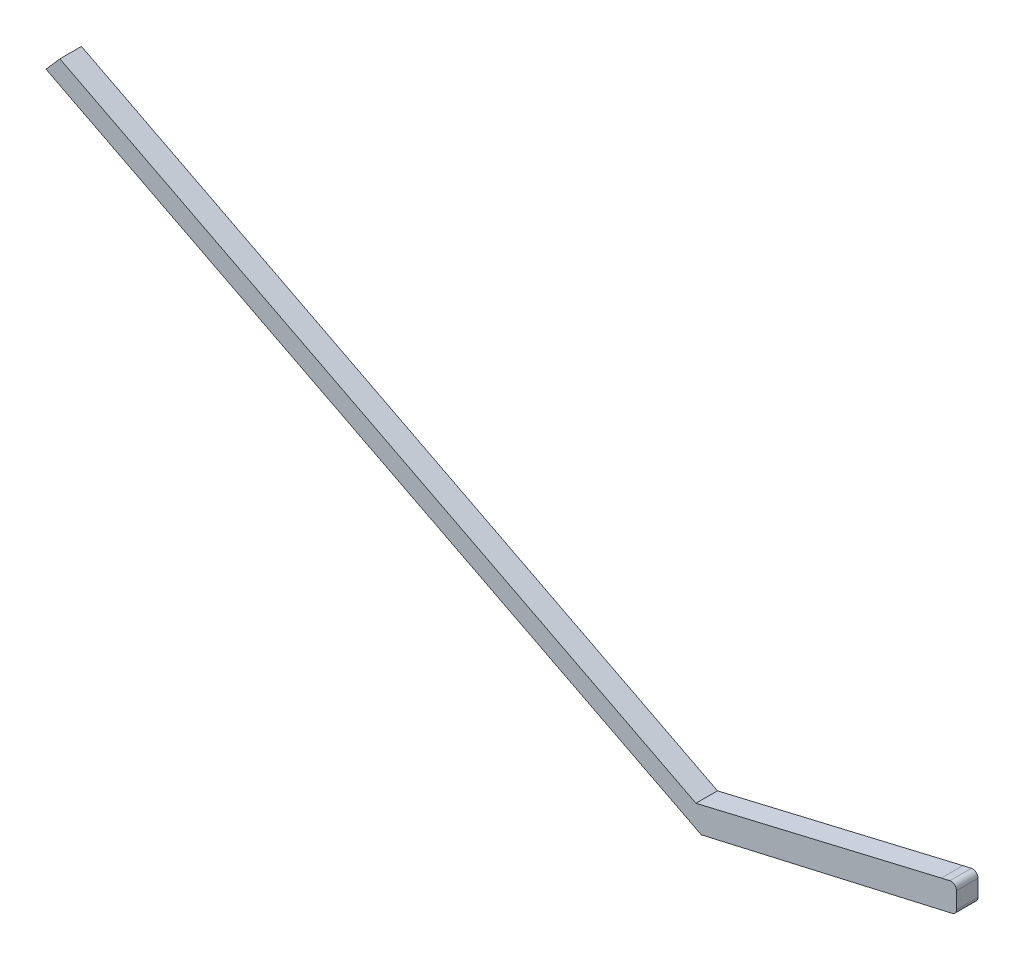
ISO-10303-21;
HEADER;
FILE_DESCRIPTION(('STEP AP214'),'2;1');
FILE_NAME('part.step','',(''),(''),'','','');
FILE_SCHEMA(('AUTOMOTIVE_DESIGN { 1 0 10303 214 1 1 1 1 }'));
ENDSEC;
DATA;
#1=APPLICATION_CONTEXT('core data for automotive mechanical design processes');
#2=APPLICATION_PROTOCOL_DEFINITION('international standard','automotive_design',2000,#1);
#3=PRODUCT_CONTEXT('',#1,'mechanical');
#4=PRODUCT('Part','Part','',(#3));
#5=PRODUCT_RELATED_PRODUCT_CATEGORY('part','',(#4));
#6=PRODUCT_DEFINITION_FORMATION('','',#4);
#7=PRODUCT_DEFINITION_CONTEXT('part definition',#1,'design');
#8=PRODUCT_DEFINITION('design','',#6,#7);
#9=PRODUCT_DEFINITION_SHAPE('','',#8);
#10=(LENGTH_UNIT() NAMED_UNIT(*) SI_UNIT(.MILLI.,.METRE.));
#11=(NAMED_UNIT(*) PLANE_ANGLE_UNIT() SI_UNIT($,.RADIAN.));
#12=(NAMED_UNIT(*) SI_UNIT($,.STERADIAN.) SOLID_ANGLE_UNIT());
#13=UNCERTAINTY_MEASURE_WITH_UNIT(LENGTH_MEASURE(1.E-05),#10,'distance_accuracy_value','');
#14=(GEOMETRIC_REPRESENTATION_CONTEXT(3) GLOBAL_UNCERTAINTY_ASSIGNED_CONTEXT((#13)) GLOBAL_UNIT_ASSIGNED_CONTEXT((#10,
#11,#12)) REPRESENTATION_CONTEXT('',''));
#15=CARTESIAN_POINT('',(0.,0.,0.));
#16=DIRECTION('',(0.,0.,1.));
#17=DIRECTION('',(1.,0.,0.));
#18=AXIS2_PLACEMENT_3D('',#15,#16,#17);
#19=CARTESIAN_POINT('',(-42.5003193569987,-16.6773008257501,2.));
#20=DIRECTION('',(0.455637859415307,0.890165232452626,0.));
#21=DIRECTION('',(-0.890165232452626,0.455637859415307,0.));
#22=AXIS2_PLACEMENT_3D('',#19,#20,#21);
#23=PLANE('',#22);
#24=DIRECTION('',(0.890165232452626,-0.455637859415307,0.));
#25=VECTOR('',#24,1.);
#26=CARTESIAN_POINT('',(-42.5003193569987,-16.6773008257501,0.));
#27=LINE('',#26,#25);
#28=CARTESIAN_POINT('',(-103.313556119557,14.4504179532271,0.));
#29=VERTEX_POINT('',#28);
#30=CARTESIAN_POINT('',(-42.5003193569987,-16.6773008257501,0.));
#31=VERTEX_POINT('',#30);
#32=EDGE_CURVE('E141',#29,#31,#27,.T.);
#33=ORIENTED_EDGE('',*,*,#32,.T.);
#34=DIRECTION('',(0.,0.,-1.));
#35=VECTOR('',#34,1.);
#36=CARTESIAN_POINT('',(-42.5003193569987,-16.6773008257501,2.));
#37=LINE('',#36,#35);
#38=CARTESIAN_POINT('',(-42.5003193569987,-16.6773008257501,2.));
#39=VERTEX_POINT('',#38);
#40=EDGE_CURVE('E11',#39,#31,#37,.T.);
#41=ORIENTED_EDGE('',*,*,#40,.F.);
#42=DIRECTION('',(0.890165232452626,-0.455637859415307,0.));
#43=VECTOR('',#42,1.);
#44=CARTESIAN_POINT('',(-42.5003193569987,-16.6773008257501,2.));
#45=LINE('',#44,#43);
#46=CARTESIAN_POINT('',(-103.313556119557,14.4504179532271,2.));
#47=VERTEX_POINT('',#46);
#48=EDGE_CURVE('E159',#47,#39,#45,.T.);
#49=ORIENTED_EDGE('',*,*,#48,.F.);
#50=DIRECTION('',(0.,0.,-1.));
#51=VECTOR('',#50,1.);
#52=CARTESIAN_POINT('',(-103.313556119557,14.4504179532271,2.));
#53=LINE('',#52,#51);
#54=EDGE_CURVE('E137',#47,#29,#53,.T.);
#55=ORIENTED_EDGE('',*,*,#54,.T.);
#56=EDGE_LOOP('',(#33,#41,#49,#55));
#57=FACE_BOUND('',#56,.T.);
#58=ADVANCED_FACE('F33',(#57),#23,.F.);
#59=CARTESIAN_POINT('',(-20.,-11.5262200151905,2.));
#60=DIRECTION('',(-0.223160367692443,0.97478174495185,0.));
#61=DIRECTION('',(-0.97478174495185,-0.223160367692443,0.));
#62=AXIS2_PLACEMENT_3D('',#59,#60,#61);
#63=PLANE('',#62);
#64=DIRECTION('',(0.97478174495185,0.223160367692443,0.));
#65=VECTOR('',#64,1.);
#66=CARTESIAN_POINT('',(-20.,-11.5262200151905,0.));
#67=LINE('',#66,#65);
#68=CARTESIAN_POINT('',(-20.,-11.5262200151905,0.));
#69=VERTEX_POINT('',#68);
#70=EDGE_CURVE('E144',#31,#69,#67,.T.);
#71=ORIENTED_EDGE('',*,*,#70,.T.);
#72=DIRECTION('',(0.,0.,-1.));
#73=VECTOR('',#72,1.);
#74=CARTESIAN_POINT('',(-20.,-11.5262200151905,2.));
#75=LINE('',#74,#73);
#76=CARTESIAN_POINT('',(-20.,-11.5262200151905,2.));
#77=VERTEX_POINT('',#76);
#78=EDGE_CURVE('E41',#77,#69,#75,.T.);
#79=ORIENTED_EDGE('',*,*,#78,.F.);
#80=DIRECTION('',(0.97478174495185,0.223160367692443,0.));
#81=VECTOR('',#80,1.);
#82=CARTESIAN_POINT('',(-20.,-11.5262200151905,2.));
#83=LINE('',#82,#81);
#84=EDGE_CURVE('E98',#39,#77,#83,.T.);
#85=ORIENTED_EDGE('',*,*,#84,.F.);
#86=ORIENTED_EDGE('',*,*,#40,.T.);
#87=EDGE_LOOP('',(#71,#79,#85,#86));
#88=FACE_BOUND('',#87,.T.);
#89=ADVANCED_FACE('F208',(#88),#63,.F.);
#90=CARTESIAN_POINT('',(-20.,-11.5262200151905,2.));
#91=DIRECTION('',(-0.2204816590475,0.975391120537634,0.));
#92=DIRECTION('',(-0.975391120537634,-0.2204816590475,0.));
#93=AXIS2_PLACEMENT_3D('',#90,#91,#92);
#94=PLANE('',#93);
#95=DIRECTION('',(0.975391120537634,0.2204816590475,0.));
#96=VECTOR('',#95,1.);
#97=CARTESIAN_POINT('',(-20.,-11.5262200151905,0.));
#98=LINE('',#97,#96);
#99=CARTESIAN_POINT('',(-19.2098276984466,-11.3476060250571,0.));
#100=VERTEX_POINT('',#99);
#101=EDGE_CURVE('E146',#69,#100,#98,.T.);
#102=ORIENTED_EDGE('',*,*,#101,.T.);
#103=DIRECTION('',(0.,0.,-1.));
#104=VECTOR('',#103,1.);
#105=CARTESIAN_POINT('',(-19.2098276984466,-11.3476060250571,2.));
#106=LINE('',#105,#104);
#107=CARTESIAN_POINT('',(-19.2098276984466,-11.3476060250571,2.));
#108=VERTEX_POINT('',#107);
#109=EDGE_CURVE('E172',#108,#100,#106,.T.);
#110=ORIENTED_EDGE('',*,*,#109,.F.);
#111=DIRECTION('',(0.975391120537634,0.2204816590475,0.));
#112=VECTOR('',#111,1.);
#113=CARTESIAN_POINT('',(-20.,-11.5262200151905,2.));
#114=LINE('',#113,#112);
#115=EDGE_CURVE('E180',#77,#108,#114,.T.);
#116=ORIENTED_EDGE('',*,*,#115,.F.);
#117=ORIENTED_EDGE('',*,*,#78,.T.);
#118=EDGE_LOOP('',(#102,#110,#116,#117));
#119=FACE_BOUND('',#118,.T.);
#120=ADVANCED_FACE('F178',(#119),#94,.F.);
#121=CARTESIAN_POINT('',(-19.3214018643038,-10.8602137749,2.));
#122=DIRECTION('',(0.,0.,-1.));
#123=DIRECTION('',(-1.,0.,0.));
#124=AXIS2_PLACEMENT_3D('',#121,#122,#123);
#125=CYLINDRICAL_SURFACE('',#124,0.500000000000001);
#126=CARTESIAN_POINT('',(-19.3214018643038,-10.8602137749,0.));
#127=DIRECTION('',(0.,0.,1.));
#128=DIRECTION('',(-1.,0.,0.));
#129=AXIS2_PLACEMENT_3D('',#126,#127,#128);
#130=CIRCLE('',#129,0.500000000000001);
#131=CARTESIAN_POINT('',(-18.8214018643038,-10.8602137749,0.));
#132=VERTEX_POINT('',#131);
#133=EDGE_CURVE('E148',#100,#132,#130,.T.);
#134=ORIENTED_EDGE('',*,*,#133,.T.);
#135=DIRECTION('',(0.,0.,-1.));
#136=VECTOR('',#135,1.);
#137=CARTESIAN_POINT('',(-18.8214018643038,-10.8602137749,2.));
#138=LINE('',#137,#136);
#139=CARTESIAN_POINT('',(-18.8214018643038,-10.8602137749,2.));
#140=VERTEX_POINT('',#139);
#141=EDGE_CURVE('E169',#140,#132,#138,.T.);
#142=ORIENTED_EDGE('',*,*,#141,.F.);
#143=CARTESIAN_POINT('',(-19.3214018643038,-10.8602137749,2.));
#144=DIRECTION('',(0.,0.,1.));
#145=DIRECTION('',(-1.,0.,0.));
#146=AXIS2_PLACEMENT_3D('',#143,#144,#145);
#147=CIRCLE('',#146,0.500000000000001);
#148=EDGE_CURVE('E198',#108,#140,#147,.T.);
#149=ORIENTED_EDGE('',*,*,#148,.F.);
#150=ORIENTED_EDGE('',*,*,#109,.T.);
#151=EDGE_LOOP('',(#134,#142,#149,#150));
#152=FACE_BOUND('',#151,.T.);
#153=ADVANCED_FACE('F189',(#152),#125,.T.);
#154=CARTESIAN_POINT('',(-18.8214018643038,-9.32141212231283,2.));
#155=DIRECTION('',(-1.,0.,0.));
#156=DIRECTION('',(0.,0.,1.));
#157=AXIS2_PLACEMENT_3D('',#154,#155,#156);
#158=PLANE('',#157);
#159=DIRECTION('',(0.,1.,0.));
#160=VECTOR('',#159,1.);
#161=CARTESIAN_POINT('',(-18.8214018643038,-9.32141212231283,0.));
#162=LINE('',#161,#160);
#163=CARTESIAN_POINT('',(-18.8214018643038,-9.32141212231283,0.));
#164=VERTEX_POINT('',#163);
#165=EDGE_CURVE('E150',#132,#164,#162,.T.);
#166=ORIENTED_EDGE('',*,*,#165,.T.);
#167=DIRECTION('',(0.,0.,-1.));
#168=VECTOR('',#167,1.);
#169=CARTESIAN_POINT('',(-18.8214018643038,-9.32141212231283,2.));
#170=LINE('',#169,#168);
#171=CARTESIAN_POINT('',(-18.8214018643038,-9.32141212231283,2.));
#172=VERTEX_POINT('',#171);
#173=EDGE_CURVE('E166',#172,#164,#170,.T.);
#174=ORIENTED_EDGE('',*,*,#173,.F.);
#175=DIRECTION('',(0.,1.,0.));
#176=VECTOR('',#175,1.);
#177=CARTESIAN_POINT('',(-18.8214018643038,-9.32141212231283,2.));
#178=LINE('',#177,#176);
#179=EDGE_CURVE('E195',#140,#172,#178,.T.);
#180=ORIENTED_EDGE('',*,*,#179,.F.);
#181=ORIENTED_EDGE('',*,*,#141,.T.);
#182=EDGE_LOOP('',(#166,#174,#180,#181));
#183=FACE_BOUND('',#182,.T.);
#184=ADVANCED_FACE('F193',(#183),#158,.F.);
#185=CARTESIAN_POINT('',(-19.3214018643038,-9.32141212231283,2.));
#186=DIRECTION('',(0.,0.,-1.));
#187=DIRECTION('',(-1.,0.,0.));
#188=AXIS2_PLACEMENT_3D('',#185,#186,#187);
#189=CYLINDRICAL_SURFACE('',#188,0.5);
#190=CARTESIAN_POINT('',(-19.3214018643038,-9.32141212231283,0.));
#191=DIRECTION('',(0.,0.,1.));
#192=DIRECTION('',(-1.,0.,0.));
#193=AXIS2_PLACEMENT_3D('',#190,#191,#192);
#194=CIRCLE('',#193,0.5);
#195=CARTESIAN_POINT('',(-19.4329760301611,-8.83401987215568,0.));
#196=VERTEX_POINT('',#195);
#197=EDGE_CURVE('E152',#164,#196,#194,.T.);
#198=ORIENTED_EDGE('',*,*,#197,.T.);
#199=DIRECTION('',(0.,0.,-1.));
#200=VECTOR('',#199,1.);
#201=CARTESIAN_POINT('',(-19.4329760301611,-8.83401987215568,2.));
#202=LINE('',#201,#200);
#203=CARTESIAN_POINT('',(-19.4329760301611,-8.83401987215568,2.));
#204=VERTEX_POINT('',#203);
#205=EDGE_CURVE('E163',#204,#196,#202,.T.);
#206=ORIENTED_EDGE('',*,*,#205,.F.);
#207=CARTESIAN_POINT('',(-19.3214018643038,-9.32141212231283,2.));
#208=DIRECTION('',(0.,0.,1.));
#209=DIRECTION('',(-1.,0.,0.));
#210=AXIS2_PLACEMENT_3D('',#207,#208,#209);
#211=CIRCLE('',#210,0.5);
#212=EDGE_CURVE('E197',#172,#204,#211,.T.);
#213=ORIENTED_EDGE('',*,*,#212,.F.);
#214=ORIENTED_EDGE('',*,*,#173,.T.);
#215=EDGE_LOOP('',(#198,#206,#213,#214));
#216=FACE_BOUND('',#215,.T.);
#217=ADVANCED_FACE('F220',(#216),#189,.T.);
#218=CARTESIAN_POINT('',(-19.4329760301611,-8.83401987215568,2.));
#219=DIRECTION('',(0.2204816590475,-0.975391120537634,0.));
#220=DIRECTION('',(0.975391120537634,0.2204816590475,0.));
#221=AXIS2_PLACEMENT_3D('',#218,#219,#220);
#222=PLANE('',#221);
#223=DIRECTION('',(-0.975391120537634,-0.2204816590475,0.));
#224=VECTOR('',#223,1.);
#225=CARTESIAN_POINT('',(-19.4329760301611,-8.83401987215568,0.));
#226=LINE('',#225,#224);
#227=CARTESIAN_POINT('',(-20.2231483317146,-9.01263386228905,0.));
#228=VERTEX_POINT('',#227);
#229=EDGE_CURVE('E154',#196,#228,#226,.T.);
#230=ORIENTED_EDGE('',*,*,#229,.T.);
#231=DIRECTION('',(0.,0.,-1.));
#232=VECTOR('',#231,1.);
#233=CARTESIAN_POINT('',(-20.2231483317146,-9.01263386228905,2.));
#234=LINE('',#233,#232);
#235=CARTESIAN_POINT('',(-20.2231483317146,-9.01263386228905,2.));
#236=VERTEX_POINT('',#235);
#237=EDGE_CURVE('E132',#236,#228,#234,.T.);
#238=ORIENTED_EDGE('',*,*,#237,.F.);
#239=DIRECTION('',(-0.975391120537634,-0.2204816590475,0.));
#240=VECTOR('',#239,1.);
#241=CARTESIAN_POINT('',(-19.4329760301611,-8.83401987215568,2.));
#242=LINE('',#241,#240);
#243=EDGE_CURVE('E123',#204,#236,#242,.T.);
#244=ORIENTED_EDGE('',*,*,#243,.F.);
#245=ORIENTED_EDGE('',*,*,#205,.T.);
#246=EDGE_LOOP('',(#230,#238,#244,#245));
#247=FACE_BOUND('',#246,.T.);
#248=ADVANCED_FACE('F223',(#247),#222,.F.);
#249=CARTESIAN_POINT('',(-42.9983031141891,-14.3898071836669,2.));
#250=DIRECTION('',(0.229780792652862,-0.973242409334808,0.));
#251=DIRECTION('',(0.973242409334808,0.229780792652862,0.));
#252=AXIS2_PLACEMENT_3D('',#249,#250,#251);
#253=PLANE('',#252);
#254=DIRECTION('',(-0.973242409334808,-0.229780792652862,0.));
#255=VECTOR('',#254,1.);
#256=CARTESIAN_POINT('',(-42.9983031141891,-14.3898071836669,0.));
#257=LINE('',#256,#255);
#258=CARTESIAN_POINT('',(-42.9983031141891,-14.3898071836669,0.));
#259=VERTEX_POINT('',#258);
#260=EDGE_CURVE('E131',#228,#259,#257,.T.);
#261=ORIENTED_EDGE('',*,*,#260,.T.);
#262=DIRECTION('',(0.,0.,-1.));
#263=VECTOR('',#262,1.);
#264=CARTESIAN_POINT('',(-42.9983031141891,-14.3898071836669,2.));
#265=LINE('',#264,#263);
#266=CARTESIAN_POINT('',(-42.9983031141891,-14.3898071836669,2.));
#267=VERTEX_POINT('',#266);
#268=EDGE_CURVE('E128',#267,#259,#265,.T.);
#269=ORIENTED_EDGE('',*,*,#268,.F.);
#270=DIRECTION('',(-0.973242409334808,-0.229780792652862,0.));
#271=VECTOR('',#270,1.);
#272=CARTESIAN_POINT('',(-42.9983031141891,-14.3898071836669,2.));
#273=LINE('',#272,#271);
#274=EDGE_CURVE('E117',#236,#267,#273,.T.);
#275=ORIENTED_EDGE('',*,*,#274,.F.);
#276=ORIENTED_EDGE('',*,*,#237,.T.);
#277=EDGE_LOOP('',(#261,#269,#275,#276));
#278=FACE_BOUND('',#277,.T.);
#279=ADVANCED_FACE('F129',(#278),#253,.F.);
#280=CARTESIAN_POINT('',(-102.02390187067,15.9263555936198,2.));
#281=DIRECTION('',(-0.456872899868873,-0.889531985577476,0.));
#282=DIRECTION('',(0.889531985577476,-0.456872899868873,0.));
#283=AXIS2_PLACEMENT_3D('',#280,#281,#282);
#284=PLANE('',#283);
#285=DIRECTION('',(-0.889531985577476,0.456872899868873,0.));
#286=VECTOR('',#285,1.);
#287=CARTESIAN_POINT('',(-102.02390187067,15.9263555936198,0.));
#288=LINE('',#287,#286);
#289=CARTESIAN_POINT('',(-102.02390187067,15.9263555936198,0.));
#290=VERTEX_POINT('',#289);
#291=EDGE_CURVE('E84',#259,#290,#288,.T.);
#292=ORIENTED_EDGE('',*,*,#291,.T.);
#293=DIRECTION('',(0.,0.,-1.));
#294=VECTOR('',#293,1.);
#295=CARTESIAN_POINT('',(-102.02390187067,15.9263555936198,2.));
#296=LINE('',#295,#294);
#297=CARTESIAN_POINT('',(-102.02390187067,15.9263555936198,2.));
#298=VERTEX_POINT('',#297);
#299=EDGE_CURVE('E133',#298,#290,#296,.T.);
#300=ORIENTED_EDGE('',*,*,#299,.F.);
#301=DIRECTION('',(-0.889531985577476,0.456872899868873,0.));
#302=VECTOR('',#301,1.);
#303=CARTESIAN_POINT('',(-102.02390187067,15.9263555936198,2.));
#304=LINE('',#303,#302);
#305=EDGE_CURVE('E121',#267,#298,#304,.T.);
#306=ORIENTED_EDGE('',*,*,#305,.F.);
#307=ORIENTED_EDGE('',*,*,#268,.T.);
#308=EDGE_LOOP('',(#292,#300,#306,#307));
#309=FACE_BOUND('',#308,.T.);
#310=ADVANCED_FACE('F135',(#309),#284,.F.);
#311=CARTESIAN_POINT('',(-103.313556119557,14.4504179532271,2.));
#312=DIRECTION('',(0.753029408363647,-0.657986861676961,0.));
#313=DIRECTION('',(0.657986861676961,0.753029408363647,0.));
#314=AXIS2_PLACEMENT_3D('',#311,#312,#313);
#315=PLANE('',#314);
#316=DIRECTION('',(-0.657986861676961,-0.753029408363646,0.));
#317=VECTOR('',#316,1.);
#318=CARTESIAN_POINT('',(-103.313556119557,14.4504179532271,0.));
#319=LINE('',#318,#317);
#320=EDGE_CURVE('E90',#290,#29,#319,.T.);
#321=ORIENTED_EDGE('',*,*,#320,.T.);
#322=ORIENTED_EDGE('',*,*,#54,.F.);
#323=DIRECTION('',(-0.657986861676961,-0.753029408363646,0.));
#324=VECTOR('',#323,1.);
#325=CARTESIAN_POINT('',(-103.313556119557,14.4504179532271,2.));
#326=LINE('',#325,#324);
#327=EDGE_CURVE('E49',#298,#47,#326,.T.);
#328=ORIENTED_EDGE('',*,*,#327,.F.);
#329=ORIENTED_EDGE('',*,*,#299,.T.);
#330=EDGE_LOOP('',(#321,#322,#328,#329));
#331=FACE_BOUND('',#330,.T.);
#332=ADVANCED_FACE('F232',(#331),#315,.F.);
#333=CARTESIAN_POINT('',(-19.3214018643038,-9.32141212231283,2.));
#334=DIRECTION('',(0.,0.,-1.));
#335=DIRECTION('',(-1.,0.,0.));
#336=AXIS2_PLACEMENT_3D('',#333,#334,#335);
#337=PLANE('',#336);
#338=ORIENTED_EDGE('',*,*,#48,.T.);
#339=ORIENTED_EDGE('',*,*,#84,.T.);
#340=ORIENTED_EDGE('',*,*,#115,.T.);
#341=ORIENTED_EDGE('',*,*,#148,.T.);
#342=ORIENTED_EDGE('',*,*,#179,.T.);
#343=ORIENTED_EDGE('',*,*,#212,.T.);
#344=ORIENTED_EDGE('',*,*,#243,.T.);
#345=ORIENTED_EDGE('',*,*,#274,.T.);
#346=ORIENTED_EDGE('',*,*,#305,.T.);
#347=ORIENTED_EDGE('',*,*,#327,.T.);
#348=EDGE_LOOP('',(#338,#339,#340,#341,#342,#343,#344,#345,#346,#347));
#349=FACE_BOUND('',#348,.T.);
#350=ADVANCED_FACE('F119',(#349),#337,.F.);
#351=CARTESIAN_POINT('',(-19.3214018643038,-9.32141212231283,0.));
#352=DIRECTION('',(0.,0.,-1.));
#353=DIRECTION('',(-1.,0.,0.));
#354=AXIS2_PLACEMENT_3D('',#351,#352,#353);
#355=PLANE('',#354);
#356=ORIENTED_EDGE('',*,*,#32,.F.);
#357=ORIENTED_EDGE('',*,*,#320,.F.);
#358=ORIENTED_EDGE('',*,*,#291,.F.);
#359=ORIENTED_EDGE('',*,*,#260,.F.);
#360=ORIENTED_EDGE('',*,*,#229,.F.);
#361=ORIENTED_EDGE('',*,*,#197,.F.);
#362=ORIENTED_EDGE('',*,*,#165,.F.);
#363=ORIENTED_EDGE('',*,*,#133,.F.);
#364=ORIENTED_EDGE('',*,*,#101,.F.);
#365=ORIENTED_EDGE('',*,*,#70,.F.);
#366=EDGE_LOOP('',(#356,#357,#358,#359,#360,#361,#362,#363,#364,#365));
#367=FACE_BOUND('',#366,.T.);
#368=ADVANCED_FACE('F184',(#367),#355,.T.);
#369=CLOSED_SHELL('',(#58,#89,#120,#153,#184,#217,#248,#279,#310,#332,#350,#368));
#370=MANIFOLD_SOLID_BREP('B2',#369);
#371=ADVANCED_BREP_SHAPE_REPRESENTATION('',(#18,#370),#14);
#372=SHAPE_DEFINITION_REPRESENTATION(#9,#371);
ENDSEC;
END-ISO-10303-21;
